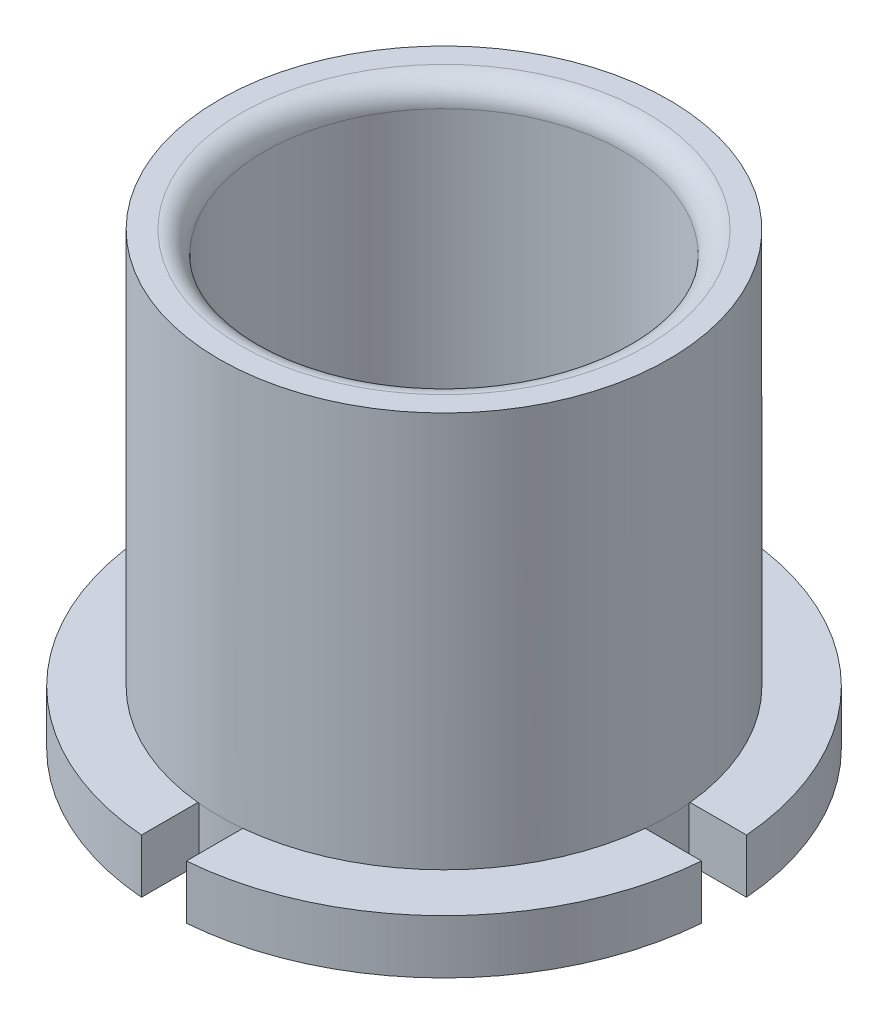
ISO-10303-21;
HEADER;
FILE_DESCRIPTION(('STEP AP214'),'2;1');
FILE_NAME('part.step','',(''),(''),'','','');
FILE_SCHEMA(('AUTOMOTIVE_DESIGN { 1 0 10303 214 1 1 1 1 }'));
ENDSEC;
DATA;
#1=APPLICATION_CONTEXT('core data for automotive mechanical design processes');
#2=APPLICATION_PROTOCOL_DEFINITION('international standard','automotive_design',2000,#1);
#3=PRODUCT_CONTEXT('',#1,'mechanical');
#4=PRODUCT('Part','Part','',(#3));
#5=PRODUCT_RELATED_PRODUCT_CATEGORY('part','',(#4));
#6=PRODUCT_DEFINITION_FORMATION('','',#4);
#7=PRODUCT_DEFINITION_CONTEXT('part definition',#1,'design');
#8=PRODUCT_DEFINITION('design','',#6,#7);
#9=PRODUCT_DEFINITION_SHAPE('','',#8);
#10=(LENGTH_UNIT() NAMED_UNIT(*) SI_UNIT(.MILLI.,.METRE.));
#11=(NAMED_UNIT(*) PLANE_ANGLE_UNIT() SI_UNIT($,.RADIAN.));
#12=(NAMED_UNIT(*) SI_UNIT($,.STERADIAN.) SOLID_ANGLE_UNIT());
#13=UNCERTAINTY_MEASURE_WITH_UNIT(LENGTH_MEASURE(1.E-05),#10,'distance_accuracy_value','');
#14=(GEOMETRIC_REPRESENTATION_CONTEXT(3) GLOBAL_UNCERTAINTY_ASSIGNED_CONTEXT((#13)) GLOBAL_UNIT_ASSIGNED_CONTEXT((#10,
#11,#12)) REPRESENTATION_CONTEXT('',''));
#15=CARTESIAN_POINT('',(0.,0.,0.));
#16=DIRECTION('',(0.,0.,1.));
#17=DIRECTION('',(1.,0.,0.));
#18=AXIS2_PLACEMENT_3D('',#15,#16,#17);
#19=CARTESIAN_POINT('',(0.,0.,0.));
#20=DIRECTION('',(0.,1.,0.));
#21=DIRECTION('',(0.,0.,1.));
#22=AXIS2_PLACEMENT_3D('',#19,#20,#21);
#23=PLANE('',#22);
#24=CARTESIAN_POINT('',(0.,0.,0.));
#25=DIRECTION('',(0.,1.,0.));
#26=DIRECTION('',(0.,0.,1.));
#27=AXIS2_PLACEMENT_3D('',#24,#25,#26);
#28=CIRCLE('',#27,10.16);
#29=CARTESIAN_POINT('',(0.,0.,10.16));
#30=VERTEX_POINT('',#29);
#31=EDGE_CURVE('E329',#30,#30,#28,.T.);
#32=ORIENTED_EDGE('',*,*,#31,.T.);
#33=EDGE_LOOP('',(#32));
#34=FACE_BOUND('',#33,.T.);
#35=CARTESIAN_POINT('',(0.,0.,0.));
#36=DIRECTION('',(0.,-1.,0.));
#37=DIRECTION('',(0.,0.,1.));
#38=AXIS2_PLACEMENT_3D('',#35,#36,#37);
#39=CIRCLE('',#38,12.6439965200881);
#40=CARTESIAN_POINT('',(-1.27,0.,-12.5800535769924));
#41=VERTEX_POINT('',#40);
#42=CARTESIAN_POINT('',(1.27,0.,-12.5800535769924));
#43=VERTEX_POINT('',#42);
#44=EDGE_CURVE('E190',#41,#43,#39,.T.);
#45=ORIENTED_EDGE('',*,*,#44,.T.);
#46=DIRECTION('',(0.,0.,-1.));
#47=VECTOR('',#46,1.);
#48=CARTESIAN_POINT('',(1.27,0.,-12.5800535769924));
#49=LINE('',#48,#47);
#50=CARTESIAN_POINT('',(1.27,0.,-15.8241184588589));
#51=VERTEX_POINT('',#50);
#52=EDGE_CURVE('E187',#43,#51,#49,.T.);
#53=ORIENTED_EDGE('',*,*,#52,.T.);
#54=CARTESIAN_POINT('',(0.,0.,0.));
#55=DIRECTION('',(0.,-1.,0.));
#56=DIRECTION('',(0.,0.,-1.));
#57=AXIS2_PLACEMENT_3D('',#54,#55,#56);
#58=CIRCLE('',#57,15.875);
#59=CARTESIAN_POINT('',(15.8241184588589,0.,-1.27));
#60=VERTEX_POINT('',#59);
#61=EDGE_CURVE('E332',#51,#60,#58,.T.);
#62=ORIENTED_EDGE('',*,*,#61,.T.);
#63=DIRECTION('',(-1.,0.,0.));
#64=VECTOR('',#63,1.);
#65=CARTESIAN_POINT('',(16.3900535769924,0.,-1.27));
#66=LINE('',#65,#64);
#67=CARTESIAN_POINT('',(12.5800535769924,0.,-1.27));
#68=VERTEX_POINT('',#67);
#69=EDGE_CURVE('E219',#60,#68,#66,.T.);
#70=ORIENTED_EDGE('',*,*,#69,.T.);
#71=CARTESIAN_POINT('',(0.,0.,0.));
#72=DIRECTION('',(0.,-1.,0.));
#73=DIRECTION('',(0.,0.,1.));
#74=AXIS2_PLACEMENT_3D('',#71,#72,#73);
#75=CIRCLE('',#74,12.6439965200881);
#76=CARTESIAN_POINT('',(12.5800535769924,0.,1.27));
#77=VERTEX_POINT('',#76);
#78=EDGE_CURVE('E223',#68,#77,#75,.T.);
#79=ORIENTED_EDGE('',*,*,#78,.T.);
#80=DIRECTION('',(1.,0.,0.));
#81=VECTOR('',#80,1.);
#82=CARTESIAN_POINT('',(12.5800535769924,0.,1.27));
#83=LINE('',#82,#81);
#84=CARTESIAN_POINT('',(15.8241184588589,0.,1.27));
#85=VERTEX_POINT('',#84);
#86=EDGE_CURVE('E228',#77,#85,#83,.T.);
#87=ORIENTED_EDGE('',*,*,#86,.T.);
#88=CARTESIAN_POINT('',(1.27,0.,15.8241184588589));
#89=VERTEX_POINT('',#88);
#90=EDGE_CURVE('E336',#85,#89,#58,.T.);
#91=ORIENTED_EDGE('',*,*,#90,.T.);
#92=DIRECTION('',(0.,0.,-1.));
#93=VECTOR('',#92,1.);
#94=CARTESIAN_POINT('',(1.27,0.,16.3900535769924));
#95=LINE('',#94,#93);
#96=CARTESIAN_POINT('',(1.27000000000001,0.,12.5800535769924));
#97=VERTEX_POINT('',#96);
#98=EDGE_CURVE('E248',#89,#97,#95,.T.);
#99=ORIENTED_EDGE('',*,*,#98,.T.);
#100=CARTESIAN_POINT('',(0.,0.,0.));
#101=DIRECTION('',(0.,-1.,0.));
#102=DIRECTION('',(0.,0.,1.));
#103=AXIS2_PLACEMENT_3D('',#100,#101,#102);
#104=CIRCLE('',#103,12.6439965200881);
#105=CARTESIAN_POINT('',(-1.27,0.,12.5800535769924));
#106=VERTEX_POINT('',#105);
#107=EDGE_CURVE('E252',#97,#106,#104,.T.);
#108=ORIENTED_EDGE('',*,*,#107,.T.);
#109=DIRECTION('',(0.,0.,1.));
#110=VECTOR('',#109,1.);
#111=CARTESIAN_POINT('',(-1.27,0.,12.5800535769924));
#112=LINE('',#111,#110);
#113=CARTESIAN_POINT('',(-1.27,0.,15.8241184588589));
#114=VERTEX_POINT('',#113);
#115=EDGE_CURVE('E257',#106,#114,#112,.T.);
#116=ORIENTED_EDGE('',*,*,#115,.T.);
#117=CARTESIAN_POINT('',(-15.8241184588589,0.,1.27));
#118=VERTEX_POINT('',#117);
#119=EDGE_CURVE('E469',#114,#118,#58,.T.);
#120=ORIENTED_EDGE('',*,*,#119,.T.);
#121=DIRECTION('',(1.,0.,0.));
#122=VECTOR('',#121,1.);
#123=CARTESIAN_POINT('',(-16.3900535769924,0.,1.27));
#124=LINE('',#123,#122);
#125=CARTESIAN_POINT('',(-12.5800535769924,0.,1.27));
#126=VERTEX_POINT('',#125);
#127=EDGE_CURVE('E277',#118,#126,#124,.T.);
#128=ORIENTED_EDGE('',*,*,#127,.T.);
#129=CARTESIAN_POINT('',(0.,0.,0.));
#130=DIRECTION('',(0.,-1.,0.));
#131=DIRECTION('',(0.,0.,1.));
#132=AXIS2_PLACEMENT_3D('',#129,#130,#131);
#133=CIRCLE('',#132,12.6439965200881);
#134=CARTESIAN_POINT('',(-12.5800535769924,0.,-1.27));
#135=VERTEX_POINT('',#134);
#136=EDGE_CURVE('E281',#126,#135,#133,.T.);
#137=ORIENTED_EDGE('',*,*,#136,.T.);
#138=DIRECTION('',(-1.,0.,0.));
#139=VECTOR('',#138,1.);
#140=CARTESIAN_POINT('',(-12.5800535769924,0.,-1.27));
#141=LINE('',#140,#139);
#142=CARTESIAN_POINT('',(-15.8241184588589,0.,-1.27));
#143=VERTEX_POINT('',#142);
#144=EDGE_CURVE('E285',#135,#143,#141,.T.);
#145=ORIENTED_EDGE('',*,*,#144,.T.);
#146=CARTESIAN_POINT('',(-1.27,0.,-15.8241184588589));
#147=VERTEX_POINT('',#146);
#148=EDGE_CURVE('E200',#143,#147,#58,.T.);
#149=ORIENTED_EDGE('',*,*,#148,.T.);
#150=DIRECTION('',(0.,0.,1.));
#151=VECTOR('',#150,1.);
#152=CARTESIAN_POINT('',(-1.27,0.,-16.3900535769924));
#153=LINE('',#152,#151);
#154=EDGE_CURVE('E180',#147,#41,#153,.T.);
#155=ORIENTED_EDGE('',*,*,#154,.T.);
#156=EDGE_LOOP('',(#45,#53,#62,#70,#79,#87,#91,#99,#108,#116,#120,#128,#137,#145,#149,#155));
#157=FACE_BOUND('',#156,.T.);
#158=ADVANCED_FACE('F39',(#34,#157),#23,.F.);
#159=CARTESIAN_POINT('',(0.,3.048,0.));
#160=DIRECTION('',(0.,-1.,0.));
#161=DIRECTION('',(0.,0.,-1.));
#162=AXIS2_PLACEMENT_3D('',#159,#160,#161);
#163=CYLINDRICAL_SURFACE('',#162,15.875);
#164=DIRECTION('',(0.,-1.,0.));
#165=VECTOR('',#164,1.);
#166=CARTESIAN_POINT('',(1.27,3.048,-15.8241184588589));
#167=LINE('',#166,#165);
#168=CARTESIAN_POINT('',(1.27,3.048,-15.8241184588589));
#169=VERTEX_POINT('',#168);
#170=EDGE_CURVE('E322',#169,#51,#167,.T.);
#171=ORIENTED_EDGE('',*,*,#170,.F.);
#172=CARTESIAN_POINT('',(0.,3.048,0.));
#173=DIRECTION('',(0.,-1.,0.));
#174=DIRECTION('',(0.,0.,-1.));
#175=AXIS2_PLACEMENT_3D('',#172,#173,#174);
#176=CIRCLE('',#175,15.875);
#177=CARTESIAN_POINT('',(15.8241184588589,3.048,-1.27));
#178=VERTEX_POINT('',#177);
#179=EDGE_CURVE('E325',#169,#178,#176,.T.);
#180=ORIENTED_EDGE('',*,*,#179,.T.);
#181=DIRECTION('',(0.,-1.,0.));
#182=VECTOR('',#181,1.);
#183=CARTESIAN_POINT('',(15.8241184588589,3.048,-1.27));
#184=LINE('',#183,#182);
#185=EDGE_CURVE('E317',#60,#178,#184,.F.);
#186=ORIENTED_EDGE('',*,*,#185,.F.);
#187=ORIENTED_EDGE('',*,*,#61,.F.);
#188=EDGE_LOOP('',(#171,#180,#186,#187));
#189=FACE_BOUND('',#188,.T.);
#190=ADVANCED_FACE('F460',(#189),#163,.T.);
#191=DIRECTION('',(0.,-1.,0.));
#192=VECTOR('',#191,1.);
#193=CARTESIAN_POINT('',(-1.27,3.048,-15.8241184588589));
#194=LINE('',#193,#192);
#195=CARTESIAN_POINT('',(-1.27,3.048,-15.8241184588589));
#196=VERTEX_POINT('',#195);
#197=EDGE_CURVE('E55',#147,#196,#194,.F.);
#198=ORIENTED_EDGE('',*,*,#197,.F.);
#199=ORIENTED_EDGE('',*,*,#148,.F.);
#200=DIRECTION('',(0.,-1.,0.));
#201=VECTOR('',#200,1.);
#202=CARTESIAN_POINT('',(-15.8241184588589,3.048,-1.27));
#203=LINE('',#202,#201);
#204=CARTESIAN_POINT('',(-15.8241184588589,3.048,-1.27));
#205=VERTEX_POINT('',#204);
#206=EDGE_CURVE('E217',#205,#143,#203,.T.);
#207=ORIENTED_EDGE('',*,*,#206,.F.);
#208=EDGE_CURVE('E331',#205,#196,#176,.T.);
#209=ORIENTED_EDGE('',*,*,#208,.T.);
#210=EDGE_LOOP('',(#198,#199,#207,#209));
#211=FACE_BOUND('',#210,.T.);
#212=ADVANCED_FACE('F392',(#211),#163,.T.);
#213=DIRECTION('',(0.,-1.,0.));
#214=VECTOR('',#213,1.);
#215=CARTESIAN_POINT('',(15.8241184588589,3.048,1.27));
#216=LINE('',#215,#214);
#217=CARTESIAN_POINT('',(15.8241184588589,3.048,1.27));
#218=VERTEX_POINT('',#217);
#219=EDGE_CURVE('E314',#218,#85,#216,.T.);
#220=ORIENTED_EDGE('',*,*,#219,.F.);
#221=CARTESIAN_POINT('',(1.27,3.048,15.8241184588589));
#222=VERTEX_POINT('',#221);
#223=EDGE_CURVE('E330',#218,#222,#176,.T.);
#224=ORIENTED_EDGE('',*,*,#223,.T.);
#225=DIRECTION('',(0.,-1.,0.));
#226=VECTOR('',#225,1.);
#227=CARTESIAN_POINT('',(1.27,3.048,15.8241184588589));
#228=LINE('',#227,#226);
#229=EDGE_CURVE('E311',#89,#222,#228,.F.);
#230=ORIENTED_EDGE('',*,*,#229,.F.);
#231=ORIENTED_EDGE('',*,*,#90,.F.);
#232=EDGE_LOOP('',(#220,#224,#230,#231));
#233=FACE_BOUND('',#232,.T.);
#234=ADVANCED_FACE('F407',(#233),#163,.T.);
#235=CARTESIAN_POINT('',(0.,3.048,0.));
#236=DIRECTION('',(0.,-1.,0.));
#237=DIRECTION('',(0.,0.,-1.));
#238=AXIS2_PLACEMENT_3D('',#235,#236,#237);
#239=PLANE('',#238);
#240=ORIENTED_EDGE('',*,*,#179,.F.);
#241=DIRECTION('',(0.,0.,1.));
#242=VECTOR('',#241,1.);
#243=CARTESIAN_POINT('',(1.27,3.048,0.));
#244=LINE('',#243,#242);
#245=CARTESIAN_POINT('',(1.27,3.048,-12.6363404512541));
#246=VERTEX_POINT('',#245);
#247=EDGE_CURVE('E11',#169,#246,#244,.T.);
#248=ORIENTED_EDGE('',*,*,#247,.T.);
#249=CARTESIAN_POINT('',(0.,3.048,0.));
#250=DIRECTION('',(0.,-1.,0.));
#251=DIRECTION('',(0.,0.,-1.));
#252=AXIS2_PLACEMENT_3D('',#249,#250,#251);
#253=CIRCLE('',#252,12.7);
#254=CARTESIAN_POINT('',(12.6363404512541,3.048,-1.27));
#255=VERTEX_POINT('',#254);
#256=EDGE_CURVE('E353',#246,#255,#253,.T.);
#257=ORIENTED_EDGE('',*,*,#256,.T.);
#258=DIRECTION('',(1.,0.,0.));
#259=VECTOR('',#258,1.);
#260=CARTESIAN_POINT('',(0.,3.048,-1.27));
#261=LINE('',#260,#259);
#262=EDGE_CURVE('E378',#255,#178,#261,.T.);
#263=ORIENTED_EDGE('',*,*,#262,.T.);
#264=EDGE_LOOP('',(#240,#248,#257,#263));
#265=FACE_BOUND('',#264,.T.);
#266=ADVANCED_FACE('F448',(#265),#239,.F.);
#267=CARTESIAN_POINT('',(-12.6363404512541,3.048,-1.27));
#268=VERTEX_POINT('',#267);
#269=CARTESIAN_POINT('',(-1.27,3.048,-12.6363404512541));
#270=VERTEX_POINT('',#269);
#271=EDGE_CURVE('E388',#268,#270,#253,.T.);
#272=ORIENTED_EDGE('',*,*,#271,.T.);
#273=DIRECTION('',(0.,0.,-1.));
#274=VECTOR('',#273,1.);
#275=CARTESIAN_POINT('',(-1.27,3.048,0.));
#276=LINE('',#275,#274);
#277=EDGE_CURVE('E48',#270,#196,#276,.T.);
#278=ORIENTED_EDGE('',*,*,#277,.T.);
#279=ORIENTED_EDGE('',*,*,#208,.F.);
#280=DIRECTION('',(1.,0.,0.));
#281=VECTOR('',#280,1.);
#282=CARTESIAN_POINT('',(0.,3.048,-1.27));
#283=LINE('',#282,#281);
#284=EDGE_CURVE('E357',#205,#268,#283,.T.);
#285=ORIENTED_EDGE('',*,*,#284,.T.);
#286=EDGE_LOOP('',(#272,#278,#279,#285));
#287=FACE_BOUND('',#286,.T.);
#288=ADVANCED_FACE('F386',(#287),#239,.F.);
#289=ORIENTED_EDGE('',*,*,#223,.F.);
#290=DIRECTION('',(-1.,0.,0.));
#291=VECTOR('',#290,1.);
#292=CARTESIAN_POINT('',(0.,3.048,1.27));
#293=LINE('',#292,#291);
#294=CARTESIAN_POINT('',(12.6363404512541,3.048,1.27));
#295=VERTEX_POINT('',#294);
#296=EDGE_CURVE('E374',#218,#295,#293,.T.);
#297=ORIENTED_EDGE('',*,*,#296,.T.);
#298=CARTESIAN_POINT('',(1.27,3.048,12.6363404512541));
#299=VERTEX_POINT('',#298);
#300=EDGE_CURVE('E415',#295,#299,#253,.T.);
#301=ORIENTED_EDGE('',*,*,#300,.T.);
#302=DIRECTION('',(0.,0.,1.));
#303=VECTOR('',#302,1.);
#304=CARTESIAN_POINT('',(1.27,3.048,0.));
#305=LINE('',#304,#303);
#306=EDGE_CURVE('E370',#299,#222,#305,.T.);
#307=ORIENTED_EDGE('',*,*,#306,.T.);
#308=EDGE_LOOP('',(#289,#297,#301,#307));
#309=FACE_BOUND('',#308,.T.);
#310=ADVANCED_FACE('F411',(#309),#239,.F.);
#311=CARTESIAN_POINT('',(0.,25.4,0.));
#312=DIRECTION('',(0.,-1.,0.));
#313=DIRECTION('',(0.,0.,-1.));
#314=AXIS2_PLACEMENT_3D('',#311,#312,#313);
#315=CYLINDRICAL_SURFACE('',#314,12.7);
#316=CARTESIAN_POINT('',(0.,25.4,0.));
#317=DIRECTION('',(0.,1.,0.));
#318=DIRECTION('',(0.,0.,1.));
#319=AXIS2_PLACEMENT_3D('',#316,#317,#318);
#320=CIRCLE('',#319,12.7);
#321=CARTESIAN_POINT('',(0.,25.4,12.7));
#322=VERTEX_POINT('',#321);
#323=EDGE_CURVE('E340',#322,#322,#320,.T.);
#324=ORIENTED_EDGE('',*,*,#323,.F.);
#325=EDGE_LOOP('',(#324));
#326=FACE_BOUND('',#325,.T.);
#327=ORIENTED_EDGE('',*,*,#256,.F.);
#328=EDGE_CURVE('E352',#270,#246,#253,.T.);
#329=ORIENTED_EDGE('',*,*,#328,.F.);
#330=ORIENTED_EDGE('',*,*,#271,.F.);
#331=CARTESIAN_POINT('',(-12.6363404512541,3.048,1.27));
#332=VERTEX_POINT('',#331);
#333=EDGE_CURVE('E434',#332,#268,#253,.T.);
#334=ORIENTED_EDGE('',*,*,#333,.F.);
#335=CARTESIAN_POINT('',(-1.27,3.048,12.6363404512541));
#336=VERTEX_POINT('',#335);
#337=EDGE_CURVE('E428',#336,#332,#253,.T.);
#338=ORIENTED_EDGE('',*,*,#337,.F.);
#339=EDGE_CURVE('E422',#299,#336,#253,.T.);
#340=ORIENTED_EDGE('',*,*,#339,.F.);
#341=ORIENTED_EDGE('',*,*,#300,.F.);
#342=EDGE_CURVE('E358',#255,#295,#253,.T.);
#343=ORIENTED_EDGE('',*,*,#342,.F.);
#344=EDGE_LOOP('',(#327,#329,#330,#334,#338,#340,#341,#343));
#345=FACE_BOUND('',#344,.T.);
#346=ADVANCED_FACE('F424',(#326,#345),#315,.T.);
#347=CARTESIAN_POINT('',(0.,25.4,0.));
#348=DIRECTION('',(0.,1.,0.));
#349=DIRECTION('',(0.,0.,1.));
#350=AXIS2_PLACEMENT_3D('',#347,#348,#349);
#351=PLANE('',#350);
#352=CARTESIAN_POINT('',(0.,25.4,0.));
#353=DIRECTION('',(0.,1.,0.));
#354=DIRECTION('',(0.,0.,1.));
#355=AXIS2_PLACEMENT_3D('',#352,#353,#354);
#356=CIRCLE('',#355,11.43);
#357=CARTESIAN_POINT('',(0.,25.4,11.43));
#358=VERTEX_POINT('',#357);
#359=EDGE_CURVE('E348',#358,#358,#356,.F.);
#360=ORIENTED_EDGE('',*,*,#359,.T.);
#361=EDGE_LOOP('',(#360));
#362=FACE_BOUND('',#361,.T.);
#363=ORIENTED_EDGE('',*,*,#323,.T.);
#364=EDGE_LOOP('',(#363));
#365=FACE_BOUND('',#364,.T.);
#366=ADVANCED_FACE('F504',(#362,#365),#351,.T.);
#367=CARTESIAN_POINT('',(0.,25.4,0.));
#368=DIRECTION('',(0.,-1.,0.));
#369=DIRECTION('',(0.,0.,-1.));
#370=AXIS2_PLACEMENT_3D('',#367,#368,#369);
#371=CYLINDRICAL_SURFACE('',#370,10.16);
#372=CARTESIAN_POINT('',(0.,24.13,0.));
#373=DIRECTION('',(0.,1.,0.));
#374=DIRECTION('',(0.,0.,1.));
#375=AXIS2_PLACEMENT_3D('',#372,#373,#374);
#376=CIRCLE('',#375,10.16);
#377=CARTESIAN_POINT('',(0.,24.13,10.16));
#378=VERTEX_POINT('',#377);
#379=EDGE_CURVE('E344',#378,#378,#376,.T.);
#380=ORIENTED_EDGE('',*,*,#379,.T.);
#381=EDGE_LOOP('',(#380));
#382=FACE_BOUND('',#381,.T.);
#383=ORIENTED_EDGE('',*,*,#31,.F.);
#384=EDGE_LOOP('',(#383));
#385=FACE_BOUND('',#384,.T.);
#386=ADVANCED_FACE('F512',(#382,#385),#371,.F.);
#387=CARTESIAN_POINT('',(0.,24.13,0.));
#388=DIRECTION('',(0.,1.,0.));
#389=DIRECTION('',(0.,0.,1.));
#390=AXIS2_PLACEMENT_3D('',#387,#388,#389);
#391=TOROIDAL_SURFACE('',#390,11.43,1.27);
#392=ORIENTED_EDGE('',*,*,#359,.F.);
#393=EDGE_LOOP('',(#392));
#394=FACE_BOUND('',#393,.T.);
#395=ORIENTED_EDGE('',*,*,#379,.F.);
#396=EDGE_LOOP('',(#395));
#397=FACE_BOUND('',#396,.T.);
#398=ADVANCED_FACE('F41',(#394,#397),#391,.T.);
#399=DIRECTION('',(0.,-1.,0.));
#400=VECTOR('',#399,1.);
#401=CARTESIAN_POINT('',(-1.27,3.048,15.8241184588589));
#402=LINE('',#401,#400);
#403=CARTESIAN_POINT('',(-1.27,3.048,15.8241184588589));
#404=VERTEX_POINT('',#403);
#405=EDGE_CURVE('E308',#404,#114,#402,.T.);
#406=ORIENTED_EDGE('',*,*,#405,.F.);
#407=CARTESIAN_POINT('',(-15.8241184588589,3.048,1.27));
#408=VERTEX_POINT('',#407);
#409=EDGE_CURVE('E394',#404,#408,#176,.T.);
#410=ORIENTED_EDGE('',*,*,#409,.T.);
#411=DIRECTION('',(0.,-1.,0.));
#412=VECTOR('',#411,1.);
#413=CARTESIAN_POINT('',(-15.8241184588589,3.048,1.27));
#414=LINE('',#413,#412);
#415=EDGE_CURVE('E305',#118,#408,#414,.F.);
#416=ORIENTED_EDGE('',*,*,#415,.F.);
#417=ORIENTED_EDGE('',*,*,#119,.F.);
#418=EDGE_LOOP('',(#406,#410,#416,#417));
#419=FACE_BOUND('',#418,.T.);
#420=ADVANCED_FACE('F475',(#419),#163,.T.);
#421=ORIENTED_EDGE('',*,*,#409,.F.);
#422=DIRECTION('',(0.,0.,-1.));
#423=VECTOR('',#422,1.);
#424=CARTESIAN_POINT('',(-1.27,3.048,0.));
#425=LINE('',#424,#423);
#426=EDGE_CURVE('E366',#404,#336,#425,.T.);
#427=ORIENTED_EDGE('',*,*,#426,.T.);
#428=ORIENTED_EDGE('',*,*,#337,.T.);
#429=DIRECTION('',(-1.,0.,0.));
#430=VECTOR('',#429,1.);
#431=CARTESIAN_POINT('',(0.,3.048,1.27));
#432=LINE('',#431,#430);
#433=EDGE_CURVE('E362',#332,#408,#432,.T.);
#434=ORIENTED_EDGE('',*,*,#433,.T.);
#435=EDGE_LOOP('',(#421,#427,#428,#434));
#436=FACE_BOUND('',#435,.T.);
#437=ADVANCED_FACE('F479',(#436),#239,.F.);
#438=CARTESIAN_POINT('',(0.,3.048,0.));
#439=DIRECTION('',(0.,1.,0.));
#440=DIRECTION('',(0.,0.,1.));
#441=AXIS2_PLACEMENT_3D('',#438,#439,#440);
#442=PLANE('',#441);
#443=DIRECTION('',(-1.,0.,0.));
#444=VECTOR('',#443,1.);
#445=CARTESIAN_POINT('',(-12.5800535769924,3.048,-1.27));
#446=LINE('',#445,#444);
#447=CARTESIAN_POINT('',(-12.5800535769924,3.048,-1.27));
#448=VERTEX_POINT('',#447);
#449=EDGE_CURVE('E63',#448,#268,#446,.T.);
#450=ORIENTED_EDGE('',*,*,#449,.F.);
#451=CARTESIAN_POINT('',(0.,3.048,0.));
#452=DIRECTION('',(0.,-1.,0.));
#453=DIRECTION('',(0.,0.,1.));
#454=AXIS2_PLACEMENT_3D('',#451,#452,#453);
#455=CIRCLE('',#454,12.6439965200881);
#456=CARTESIAN_POINT('',(-12.5800535769924,3.048,1.27));
#457=VERTEX_POINT('',#456);
#458=EDGE_CURVE('E292',#457,#448,#455,.T.);
#459=ORIENTED_EDGE('',*,*,#458,.F.);
#460=DIRECTION('',(1.,0.,0.));
#461=VECTOR('',#460,1.);
#462=CARTESIAN_POINT('',(-16.3900535769924,3.048,1.27));
#463=LINE('',#462,#461);
#464=EDGE_CURVE('E289',#332,#457,#463,.T.);
#465=ORIENTED_EDGE('',*,*,#464,.F.);
#466=ORIENTED_EDGE('',*,*,#333,.T.);
#467=EDGE_LOOP('',(#450,#459,#465,#466));
#468=FACE_BOUND('',#467,.T.);
#469=ADVANCED_FACE('F522',(#468),#442,.F.);
#470=CARTESIAN_POINT('',(-16.3900535769924,0.,1.27));
#471=DIRECTION('',(0.,0.,1.));
#472=DIRECTION('',(1.,0.,0.));
#473=AXIS2_PLACEMENT_3D('',#470,#471,#472);
#474=PLANE('',#473);
#475=ORIENTED_EDGE('',*,*,#415,.T.);
#476=ORIENTED_EDGE('',*,*,#433,.F.);
#477=ORIENTED_EDGE('',*,*,#464,.T.);
#478=DIRECTION('',(0.,1.,0.));
#479=VECTOR('',#478,1.);
#480=CARTESIAN_POINT('',(-12.5800535769924,0.,1.27));
#481=LINE('',#480,#479);
#482=EDGE_CURVE('E288',#126,#457,#481,.T.);
#483=ORIENTED_EDGE('',*,*,#482,.F.);
#484=ORIENTED_EDGE('',*,*,#127,.F.);
#485=EDGE_LOOP('',(#475,#476,#477,#483,#484));
#486=FACE_BOUND('',#485,.T.);
#487=ADVANCED_FACE('F478',(#486),#474,.F.);
#488=CARTESIAN_POINT('',(-12.5800535769924,0.,-1.27));
#489=DIRECTION('',(0.,0.,-1.));
#490=DIRECTION('',(-1.,0.,0.));
#491=AXIS2_PLACEMENT_3D('',#488,#489,#490);
#492=PLANE('',#491);
#493=ORIENTED_EDGE('',*,*,#206,.T.);
#494=ORIENTED_EDGE('',*,*,#144,.F.);
#495=DIRECTION('',(0.,1.,0.));
#496=VECTOR('',#495,1.);
#497=CARTESIAN_POINT('',(-12.5800535769924,0.,-1.27));
#498=LINE('',#497,#496);
#499=EDGE_CURVE('E266',#135,#448,#498,.T.);
#500=ORIENTED_EDGE('',*,*,#499,.T.);
#501=ORIENTED_EDGE('',*,*,#449,.T.);
#502=ORIENTED_EDGE('',*,*,#284,.F.);
#503=EDGE_LOOP('',(#493,#494,#500,#501,#502));
#504=FACE_BOUND('',#503,.T.);
#505=ADVANCED_FACE('F575',(#504),#492,.F.);
#506=CARTESIAN_POINT('',(0.,0.,0.));
#507=DIRECTION('',(0.,1.,0.));
#508=DIRECTION('',(0.,0.,1.));
#509=AXIS2_PLACEMENT_3D('',#506,#507,#508);
#510=CYLINDRICAL_SURFACE('',#509,12.6439965200881);
#511=ORIENTED_EDGE('',*,*,#458,.T.);
#512=ORIENTED_EDGE('',*,*,#499,.F.);
#513=ORIENTED_EDGE('',*,*,#136,.F.);
#514=ORIENTED_EDGE('',*,*,#482,.T.);
#515=EDGE_LOOP('',(#511,#512,#513,#514));
#516=FACE_BOUND('',#515,.T.);
#517=ADVANCED_FACE('F583',(#516),#510,.T.);
#518=CARTESIAN_POINT('',(0.,3.048,0.));
#519=DIRECTION('',(0.,1.,0.));
#520=DIRECTION('',(0.,0.,1.));
#521=AXIS2_PLACEMENT_3D('',#518,#519,#520);
#522=PLANE('',#521);
#523=DIRECTION('',(0.,0.,1.));
#524=VECTOR('',#523,1.);
#525=CARTESIAN_POINT('',(-1.27,3.048,12.5800535769924));
#526=LINE('',#525,#524);
#527=CARTESIAN_POINT('',(-1.27,3.048,12.5800535769924));
#528=VERTEX_POINT('',#527);
#529=EDGE_CURVE('E253',#528,#336,#526,.T.);
#530=ORIENTED_EDGE('',*,*,#529,.F.);
#531=CARTESIAN_POINT('',(0.,3.048,0.));
#532=DIRECTION('',(0.,-1.,0.));
#533=DIRECTION('',(0.,0.,1.));
#534=AXIS2_PLACEMENT_3D('',#531,#532,#533);
#535=CIRCLE('',#534,12.6439965200881);
#536=CARTESIAN_POINT('',(1.27000000000001,3.048,12.5800535769924));
#537=VERTEX_POINT('',#536);
#538=EDGE_CURVE('E265',#537,#528,#535,.T.);
#539=ORIENTED_EDGE('',*,*,#538,.F.);
#540=DIRECTION('',(0.,0.,-1.));
#541=VECTOR('',#540,1.);
#542=CARTESIAN_POINT('',(1.27,3.048,16.3900535769924));
#543=LINE('',#542,#541);
#544=EDGE_CURVE('E262',#299,#537,#543,.T.);
#545=ORIENTED_EDGE('',*,*,#544,.F.);
#546=ORIENTED_EDGE('',*,*,#339,.T.);
#547=EDGE_LOOP('',(#530,#539,#545,#546));
#548=FACE_BOUND('',#547,.T.);
#549=ADVANCED_FACE('F483',(#548),#522,.F.);
#550=CARTESIAN_POINT('',(1.27,0.,16.3900535769924));
#551=DIRECTION('',(1.,0.,0.));
#552=DIRECTION('',(0.,0.,-1.));
#553=AXIS2_PLACEMENT_3D('',#550,#551,#552);
#554=PLANE('',#553);
#555=ORIENTED_EDGE('',*,*,#229,.T.);
#556=ORIENTED_EDGE('',*,*,#306,.F.);
#557=ORIENTED_EDGE('',*,*,#544,.T.);
#558=DIRECTION('',(0.,1.,0.));
#559=VECTOR('',#558,1.);
#560=CARTESIAN_POINT('',(1.27000000000001,0.,12.5800535769924));
#561=LINE('',#560,#559);
#562=EDGE_CURVE('E261',#97,#537,#561,.T.);
#563=ORIENTED_EDGE('',*,*,#562,.F.);
#564=ORIENTED_EDGE('',*,*,#98,.F.);
#565=EDGE_LOOP('',(#555,#556,#557,#563,#564));
#566=FACE_BOUND('',#565,.T.);
#567=ADVANCED_FACE('F418',(#566),#554,.F.);
#568=CARTESIAN_POINT('',(-1.27,0.,12.5800535769924));
#569=DIRECTION('',(-1.,0.,0.));
#570=DIRECTION('',(0.,0.,1.));
#571=AXIS2_PLACEMENT_3D('',#568,#569,#570);
#572=PLANE('',#571);
#573=ORIENTED_EDGE('',*,*,#405,.T.);
#574=ORIENTED_EDGE('',*,*,#115,.F.);
#575=DIRECTION('',(0.,1.,0.));
#576=VECTOR('',#575,1.);
#577=CARTESIAN_POINT('',(-1.27,0.,12.5800535769924));
#578=LINE('',#577,#576);
#579=EDGE_CURVE('E237',#106,#528,#578,.T.);
#580=ORIENTED_EDGE('',*,*,#579,.T.);
#581=ORIENTED_EDGE('',*,*,#529,.T.);
#582=ORIENTED_EDGE('',*,*,#426,.F.);
#583=EDGE_LOOP('',(#573,#574,#580,#581,#582));
#584=FACE_BOUND('',#583,.T.);
#585=ADVANCED_FACE('F481',(#584),#572,.F.);
#586=CARTESIAN_POINT('',(0.,0.,0.));
#587=DIRECTION('',(0.,1.,0.));
#588=DIRECTION('',(0.,0.,1.));
#589=AXIS2_PLACEMENT_3D('',#586,#587,#588);
#590=CYLINDRICAL_SURFACE('',#589,12.6439965200881);
#591=ORIENTED_EDGE('',*,*,#538,.T.);
#592=ORIENTED_EDGE('',*,*,#579,.F.);
#593=ORIENTED_EDGE('',*,*,#107,.F.);
#594=ORIENTED_EDGE('',*,*,#562,.T.);
#595=EDGE_LOOP('',(#591,#592,#593,#594));
#596=FACE_BOUND('',#595,.T.);
#597=ADVANCED_FACE('F485',(#596),#590,.T.);
#598=CARTESIAN_POINT('',(0.,3.048,0.));
#599=DIRECTION('',(0.,1.,0.));
#600=DIRECTION('',(0.,0.,1.));
#601=AXIS2_PLACEMENT_3D('',#598,#599,#600);
#602=PLANE('',#601);
#603=DIRECTION('',(1.,0.,0.));
#604=VECTOR('',#603,1.);
#605=CARTESIAN_POINT('',(12.5800535769924,3.048,1.27));
#606=LINE('',#605,#604);
#607=CARTESIAN_POINT('',(12.5800535769924,3.048,1.27));
#608=VERTEX_POINT('',#607);
#609=EDGE_CURVE('E224',#608,#295,#606,.T.);
#610=ORIENTED_EDGE('',*,*,#609,.F.);
#611=CARTESIAN_POINT('',(0.,3.048,0.));
#612=DIRECTION('',(0.,-1.,0.));
#613=DIRECTION('',(0.,0.,1.));
#614=AXIS2_PLACEMENT_3D('',#611,#612,#613);
#615=CIRCLE('',#614,12.6439965200881);
#616=CARTESIAN_POINT('',(12.5800535769924,3.048,-1.27));
#617=VERTEX_POINT('',#616);
#618=EDGE_CURVE('E236',#617,#608,#615,.T.);
#619=ORIENTED_EDGE('',*,*,#618,.F.);
#620=DIRECTION('',(-1.,0.,0.));
#621=VECTOR('',#620,1.);
#622=CARTESIAN_POINT('',(16.3900535769924,3.048,-1.27));
#623=LINE('',#622,#621);
#624=EDGE_CURVE('E233',#255,#617,#623,.T.);
#625=ORIENTED_EDGE('',*,*,#624,.F.);
#626=ORIENTED_EDGE('',*,*,#342,.T.);
#627=EDGE_LOOP('',(#610,#619,#625,#626));
#628=FACE_BOUND('',#627,.T.);
#629=ADVANCED_FACE('F453',(#628),#602,.F.);
#630=CARTESIAN_POINT('',(16.3900535769924,0.,-1.27));
#631=DIRECTION('',(0.,0.,-1.));
#632=DIRECTION('',(-1.,0.,0.));
#633=AXIS2_PLACEMENT_3D('',#630,#631,#632);
#634=PLANE('',#633);
#635=ORIENTED_EDGE('',*,*,#185,.T.);
#636=ORIENTED_EDGE('',*,*,#262,.F.);
#637=ORIENTED_EDGE('',*,*,#624,.T.);
#638=DIRECTION('',(0.,1.,0.));
#639=VECTOR('',#638,1.);
#640=CARTESIAN_POINT('',(12.5800535769924,0.,-1.27));
#641=LINE('',#640,#639);
#642=EDGE_CURVE('E232',#68,#617,#641,.T.);
#643=ORIENTED_EDGE('',*,*,#642,.F.);
#644=ORIENTED_EDGE('',*,*,#69,.F.);
#645=EDGE_LOOP('',(#635,#636,#637,#643,#644));
#646=FACE_BOUND('',#645,.T.);
#647=ADVANCED_FACE('F457',(#646),#634,.F.);
#648=CARTESIAN_POINT('',(12.5800535769924,0.,1.27));
#649=DIRECTION('',(0.,0.,1.));
#650=DIRECTION('',(1.,0.,0.));
#651=AXIS2_PLACEMENT_3D('',#648,#649,#650);
#652=PLANE('',#651);
#653=ORIENTED_EDGE('',*,*,#219,.T.);
#654=ORIENTED_EDGE('',*,*,#86,.F.);
#655=DIRECTION('',(0.,1.,0.));
#656=VECTOR('',#655,1.);
#657=CARTESIAN_POINT('',(12.5800535769924,0.,1.27));
#658=LINE('',#657,#656);
#659=EDGE_CURVE('E213',#77,#608,#658,.T.);
#660=ORIENTED_EDGE('',*,*,#659,.T.);
#661=ORIENTED_EDGE('',*,*,#609,.T.);
#662=ORIENTED_EDGE('',*,*,#296,.F.);
#663=EDGE_LOOP('',(#653,#654,#660,#661,#662));
#664=FACE_BOUND('',#663,.T.);
#665=ADVANCED_FACE('F467',(#664),#652,.F.);
#666=CARTESIAN_POINT('',(0.,0.,0.));
#667=DIRECTION('',(0.,1.,0.));
#668=DIRECTION('',(0.,0.,1.));
#669=AXIS2_PLACEMENT_3D('',#666,#667,#668);
#670=CYLINDRICAL_SURFACE('',#669,12.6439965200881);
#671=ORIENTED_EDGE('',*,*,#618,.T.);
#672=ORIENTED_EDGE('',*,*,#659,.F.);
#673=ORIENTED_EDGE('',*,*,#78,.F.);
#674=ORIENTED_EDGE('',*,*,#642,.T.);
#675=EDGE_LOOP('',(#671,#672,#673,#674));
#676=FACE_BOUND('',#675,.T.);
#677=ADVANCED_FACE('F464',(#676),#670,.T.);
#678=CARTESIAN_POINT('',(0.,3.048,0.));
#679=DIRECTION('',(0.,1.,0.));
#680=DIRECTION('',(0.,0.,1.));
#681=AXIS2_PLACEMENT_3D('',#678,#679,#680);
#682=PLANE('',#681);
#683=DIRECTION('',(0.,0.,-1.));
#684=VECTOR('',#683,1.);
#685=CARTESIAN_POINT('',(1.27,3.048,-12.5800535769924));
#686=LINE('',#685,#684);
#687=CARTESIAN_POINT('',(1.27,3.048,-12.5800535769924));
#688=VERTEX_POINT('',#687);
#689=EDGE_CURVE('E202',#688,#246,#686,.T.);
#690=ORIENTED_EDGE('',*,*,#689,.F.);
#691=CARTESIAN_POINT('',(0.,3.048,0.));
#692=DIRECTION('',(0.,-1.,0.));
#693=DIRECTION('',(0.,0.,1.));
#694=AXIS2_PLACEMENT_3D('',#691,#692,#693);
#695=CIRCLE('',#694,12.6439965200881);
#696=CARTESIAN_POINT('',(-1.27,3.048,-12.5800535769924));
#697=VERTEX_POINT('',#696);
#698=EDGE_CURVE('E206',#697,#688,#695,.T.);
#699=ORIENTED_EDGE('',*,*,#698,.F.);
#700=DIRECTION('',(0.,0.,1.));
#701=VECTOR('',#700,1.);
#702=CARTESIAN_POINT('',(-1.27,3.048,-16.3900535769924));
#703=LINE('',#702,#701);
#704=EDGE_CURVE('E181',#270,#697,#703,.T.);
#705=ORIENTED_EDGE('',*,*,#704,.F.);
#706=ORIENTED_EDGE('',*,*,#328,.T.);
#707=EDGE_LOOP('',(#690,#699,#705,#706));
#708=FACE_BOUND('',#707,.T.);
#709=ADVANCED_FACE('F442',(#708),#682,.F.);
#710=CARTESIAN_POINT('',(1.27,0.,-12.5800535769924));
#711=DIRECTION('',(1.,0.,0.));
#712=DIRECTION('',(0.,0.,-1.));
#713=AXIS2_PLACEMENT_3D('',#710,#711,#712);
#714=PLANE('',#713);
#715=ORIENTED_EDGE('',*,*,#170,.T.);
#716=ORIENTED_EDGE('',*,*,#52,.F.);
#717=DIRECTION('',(0.,1.,0.));
#718=VECTOR('',#717,1.);
#719=CARTESIAN_POINT('',(1.27,0.,-12.5800535769924));
#720=LINE('',#719,#718);
#721=EDGE_CURVE('E186',#43,#688,#720,.T.);
#722=ORIENTED_EDGE('',*,*,#721,.T.);
#723=ORIENTED_EDGE('',*,*,#689,.T.);
#724=ORIENTED_EDGE('',*,*,#247,.F.);
#725=EDGE_LOOP('',(#715,#716,#722,#723,#724));
#726=FACE_BOUND('',#725,.T.);
#727=ADVANCED_FACE('F444',(#726),#714,.F.);
#728=CARTESIAN_POINT('',(0.,0.,0.));
#729=DIRECTION('',(0.,1.,0.));
#730=DIRECTION('',(0.,0.,1.));
#731=AXIS2_PLACEMENT_3D('',#728,#729,#730);
#732=CYLINDRICAL_SURFACE('',#731,12.6439965200881);
#733=ORIENTED_EDGE('',*,*,#698,.T.);
#734=ORIENTED_EDGE('',*,*,#721,.F.);
#735=ORIENTED_EDGE('',*,*,#44,.F.);
#736=DIRECTION('',(0.,1.,0.));
#737=VECTOR('',#736,1.);
#738=CARTESIAN_POINT('',(-1.27,0.,-12.5800535769924));
#739=LINE('',#738,#737);
#740=EDGE_CURVE('E176',#41,#697,#739,.T.);
#741=ORIENTED_EDGE('',*,*,#740,.T.);
#742=EDGE_LOOP('',(#733,#734,#735,#741));
#743=FACE_BOUND('',#742,.T.);
#744=ADVANCED_FACE('F191',(#743),#732,.T.);
#745=CARTESIAN_POINT('',(-1.27,0.,-16.3900535769924));
#746=DIRECTION('',(-1.,0.,0.));
#747=DIRECTION('',(0.,0.,1.));
#748=AXIS2_PLACEMENT_3D('',#745,#746,#747);
#749=PLANE('',#748);
#750=ORIENTED_EDGE('',*,*,#197,.T.);
#751=ORIENTED_EDGE('',*,*,#277,.F.);
#752=ORIENTED_EDGE('',*,*,#704,.T.);
#753=ORIENTED_EDGE('',*,*,#740,.F.);
#754=ORIENTED_EDGE('',*,*,#154,.F.);
#755=EDGE_LOOP('',(#750,#751,#752,#753,#754));
#756=FACE_BOUND('',#755,.T.);
#757=ADVANCED_FACE('F178',(#756),#749,.F.);
#758=CLOSED_SHELL('',(#158,#190,#212,#234,#266,#288,#310,#346,#366,#386,#398,#420,#437,#469,
#487,#505,#517,#549,#567,#585,#597,#629,#647,#665,#677,#709,#727,#744,#757));
#759=MANIFOLD_SOLID_BREP('B2',#758);
#760=ADVANCED_BREP_SHAPE_REPRESENTATION('',(#18,#759),#14);
#761=SHAPE_DEFINITION_REPRESENTATION(#9,#760);
ENDSEC;
END-ISO-10303-21;
